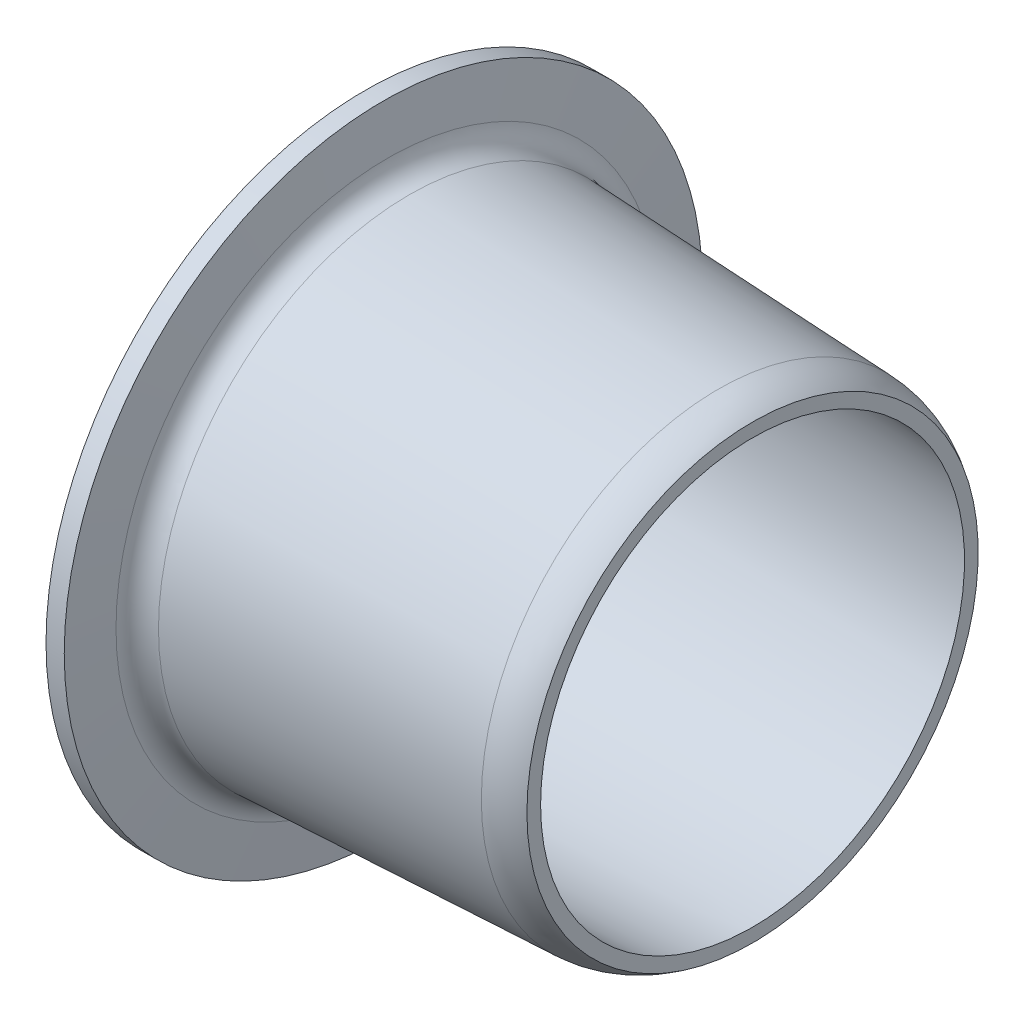
ISO-10303-21;
HEADER;
FILE_DESCRIPTION(('STEP AP214'),'2;1');
FILE_NAME('part.step','',(''),(''),'','','');
FILE_SCHEMA(('AUTOMOTIVE_DESIGN { 1 0 10303 214 1 1 1 1 }'));
ENDSEC;
DATA;
#1=APPLICATION_CONTEXT('core data for automotive mechanical design processes');
#2=APPLICATION_PROTOCOL_DEFINITION('international standard','automotive_design',2000,#1);
#3=PRODUCT_CONTEXT('',#1,'mechanical');
#4=PRODUCT('Part','Part','',(#3));
#5=PRODUCT_RELATED_PRODUCT_CATEGORY('part','',(#4));
#6=PRODUCT_DEFINITION_FORMATION('','',#4);
#7=PRODUCT_DEFINITION_CONTEXT('part definition',#1,'design');
#8=PRODUCT_DEFINITION('design','',#6,#7);
#9=PRODUCT_DEFINITION_SHAPE('','',#8);
#10=(LENGTH_UNIT() NAMED_UNIT(*) SI_UNIT(.MILLI.,.METRE.));
#11=(NAMED_UNIT(*) PLANE_ANGLE_UNIT() SI_UNIT($,.RADIAN.));
#12=(NAMED_UNIT(*) SI_UNIT($,.STERADIAN.) SOLID_ANGLE_UNIT());
#13=UNCERTAINTY_MEASURE_WITH_UNIT(LENGTH_MEASURE(1.E-05),#10,'distance_accuracy_value','');
#14=(GEOMETRIC_REPRESENTATION_CONTEXT(3) GLOBAL_UNCERTAINTY_ASSIGNED_CONTEXT((#13)) GLOBAL_UNIT_ASSIGNED_CONTEXT((#10,
#11,#12)) REPRESENTATION_CONTEXT('',''));
#15=CARTESIAN_POINT('',(0.,0.,0.));
#16=DIRECTION('',(0.,0.,1.));
#17=DIRECTION('',(1.,0.,0.));
#18=AXIS2_PLACEMENT_3D('',#15,#16,#17);
#19=CARTESIAN_POINT('',(0.196537583948713,0.,0.));
#20=DIRECTION('',(-1.,0.,0.));
#21=DIRECTION('',(0.,0.,1.));
#22=AXIS2_PLACEMENT_3D('',#19,#20,#21);
#23=CONICAL_SURFACE('',#22,2.38237350444965,1.48352986419519);
#24=CARTESIAN_POINT('',(0.16,0.,0.));
#25=DIRECTION('',(-1.,0.,0.));
#26=DIRECTION('',(0.,0.,1.));
#27=AXIS2_PLACEMENT_3D('',#24,#25,#26);
#28=CIRCLE('',#27,2.8);
#29=CARTESIAN_POINT('',(0.16,0.,2.8));
#30=VERTEX_POINT('',#29);
#31=EDGE_CURVE('E10',#30,#30,#28,.T.);
#32=ORIENTED_EDGE('',*,*,#31,.F.);
#33=EDGE_LOOP('',(#32));
#34=FACE_BOUND('',#33,.T.);
#35=CARTESIAN_POINT('',(0.196537583948713,0.,0.));
#36=DIRECTION('',(-1.,0.,0.));
#37=DIRECTION('',(0.,0.,1.));
#38=AXIS2_PLACEMENT_3D('',#35,#36,#37);
#39=CIRCLE('',#38,2.38237350444965);
#40=CARTESIAN_POINT('',(0.196537583948713,0.,2.38237350444965));
#41=VERTEX_POINT('',#40);
#42=EDGE_CURVE('E65',#41,#41,#39,.T.);
#43=ORIENTED_EDGE('',*,*,#42,.T.);
#44=EDGE_LOOP('',(#43));
#45=FACE_BOUND('',#44,.T.);
#46=ADVANCED_FACE('F34',(#34,#45),#23,.T.);
#47=CARTESIAN_POINT('',(0.,0.,0.));
#48=DIRECTION('',(-1.,0.,0.));
#49=DIRECTION('',(0.,0.,1.));
#50=AXIS2_PLACEMENT_3D('',#47,#48,#49);
#51=CYLINDRICAL_SURFACE('',#50,2.8);
#52=CARTESIAN_POINT('',(0.,0.,0.));
#53=DIRECTION('',(-1.,0.,0.));
#54=DIRECTION('',(0.,0.,1.));
#55=AXIS2_PLACEMENT_3D('',#52,#53,#54);
#56=CIRCLE('',#55,2.8);
#57=CARTESIAN_POINT('',(0.,0.,2.8));
#58=VERTEX_POINT('',#57);
#59=EDGE_CURVE('E40',#58,#58,#56,.T.);
#60=ORIENTED_EDGE('',*,*,#59,.F.);
#61=EDGE_LOOP('',(#60));
#62=FACE_BOUND('',#61,.T.);
#63=ORIENTED_EDGE('',*,*,#31,.T.);
#64=EDGE_LOOP('',(#63));
#65=FACE_BOUND('',#64,.T.);
#66=ADVANCED_FACE('F108',(#62,#65),#51,.T.);
#67=CARTESIAN_POINT('',(0.,2.19980990378841,0.));
#68=DIRECTION('',(1.,0.,0.));
#69=DIRECTION('',(0.,0.,-1.));
#70=AXIS2_PLACEMENT_3D('',#67,#68,#69);
#71=PLANE('',#70);
#72=CARTESIAN_POINT('',(0.,0.,0.));
#73=DIRECTION('',(-1.,0.,0.));
#74=DIRECTION('',(0.,0.,1.));
#75=AXIS2_PLACEMENT_3D('',#72,#73,#74);
#76=CIRCLE('',#75,2.19980990378841);
#77=CARTESIAN_POINT('',(0.,0.,2.19980990378841));
#78=VERTEX_POINT('',#77);
#79=EDGE_CURVE('E44',#78,#78,#76,.T.);
#80=ORIENTED_EDGE('',*,*,#79,.F.);
#81=EDGE_LOOP('',(#80));
#82=FACE_BOUND('',#81,.T.);
#83=ORIENTED_EDGE('',*,*,#59,.T.);
#84=EDGE_LOOP('',(#83));
#85=FACE_BOUND('',#84,.T.);
#86=ADVANCED_FACE('F103',(#82,#85),#71,.F.);
#87=CARTESIAN_POINT('',(0.2,0.,0.));
#88=DIRECTION('',(-1.,0.,0.));
#89=DIRECTION('',(0.,0.,1.));
#90=AXIS2_PLACEMENT_3D('',#87,#88,#89);
#91=TOROIDAL_SURFACE('',#90,2.19980990378841,0.2);
#92=CARTESIAN_POINT('',(0.191282067443029,0.,0.));
#93=DIRECTION('',(-1.,0.,0.));
#94=DIRECTION('',(0.,0.,1.));
#95=AXIS2_PLACEMENT_3D('',#92,#93,#94);
#96=CIRCLE('',#95,2.);
#97=CARTESIAN_POINT('',(0.191282067443029,0.,2.));
#98=VERTEX_POINT('',#97);
#99=EDGE_CURVE('E48',#98,#98,#96,.T.);
#100=ORIENTED_EDGE('',*,*,#99,.F.);
#101=EDGE_LOOP('',(#100));
#102=FACE_BOUND('',#101,.T.);
#103=ORIENTED_EDGE('',*,*,#79,.T.);
#104=EDGE_LOOP('',(#103));
#105=FACE_BOUND('',#104,.T.);
#106=ADVANCED_FACE('F97',(#102,#105),#91,.T.);
#107=CARTESIAN_POINT('',(0.191282067443029,0.,0.));
#108=DIRECTION('',(-1.,0.,0.));
#109=DIRECTION('',(0.,0.,1.));
#110=AXIS2_PLACEMENT_3D('',#107,#108,#109);
#111=CONICAL_SURFACE('',#110,2.,0.0436034784205338);
#112=CARTESIAN_POINT('',(3.4,0.,0.));
#113=DIRECTION('',(-1.,0.,0.));
#114=DIRECTION('',(0.,0.,1.));
#115=AXIS2_PLACEMENT_3D('',#112,#113,#114);
#116=CIRCLE('',#115,1.86);
#117=CARTESIAN_POINT('',(3.4,0.,1.86));
#118=VERTEX_POINT('',#117);
#119=EDGE_CURVE('E53',#118,#118,#116,.T.);
#120=ORIENTED_EDGE('',*,*,#119,.F.);
#121=EDGE_LOOP('',(#120));
#122=FACE_BOUND('',#121,.T.);
#123=ORIENTED_EDGE('',*,*,#99,.T.);
#124=EDGE_LOOP('',(#123));
#125=FACE_BOUND('',#124,.T.);
#126=ADVANCED_FACE('F91',(#122,#125),#111,.F.);
#127=CARTESIAN_POINT('',(3.4,1.98,0.));
#128=DIRECTION('',(-1.,0.,0.));
#129=DIRECTION('',(0.,0.,1.));
#130=AXIS2_PLACEMENT_3D('',#127,#128,#129);
#131=PLANE('',#130);
#132=CARTESIAN_POINT('',(3.4,0.,0.));
#133=DIRECTION('',(-1.,0.,0.));
#134=DIRECTION('',(0.,0.,1.));
#135=AXIS2_PLACEMENT_3D('',#132,#133,#134);
#136=CIRCLE('',#135,1.98);
#137=CARTESIAN_POINT('',(3.4,0.,1.98));
#138=VERTEX_POINT('',#137);
#139=EDGE_CURVE('E56',#138,#138,#136,.T.);
#140=ORIENTED_EDGE('',*,*,#139,.F.);
#141=EDGE_LOOP('',(#140));
#142=FACE_BOUND('',#141,.T.);
#143=ORIENTED_EDGE('',*,*,#119,.T.);
#144=EDGE_LOOP('',(#143));
#145=FACE_BOUND('',#144,.T.);
#146=ADVANCED_FACE('F85',(#142,#145),#131,.F.);
#147=CARTESIAN_POINT('',(3.07450129779613,0.,0.));
#148=DIRECTION('',(-1.,0.,0.));
#149=DIRECTION('',(0.,0.,1.));
#150=AXIS2_PLACEMENT_3D('',#147,#148,#149);
#151=TOROIDAL_SURFACE('',#150,1.5035038933884,0.577059741060153);
#152=CARTESIAN_POINT('',(3.1,0.,0.));
#153=DIRECTION('',(-1.,0.,0.));
#154=DIRECTION('',(0.,0.,1.));
#155=AXIS2_PLACEMENT_3D('',#152,#153,#154);
#156=CIRCLE('',#155,2.08);
#157=CARTESIAN_POINT('',(3.1,0.,2.08));
#158=VERTEX_POINT('',#157);
#159=EDGE_CURVE('E59',#158,#158,#156,.T.);
#160=ORIENTED_EDGE('',*,*,#159,.F.);
#161=EDGE_LOOP('',(#160));
#162=FACE_BOUND('',#161,.T.);
#163=ORIENTED_EDGE('',*,*,#139,.T.);
#164=EDGE_LOOP('',(#163));
#165=FACE_BOUND('',#164,.T.);
#166=ADVANCED_FACE('F79',(#162,#165),#151,.T.);
#167=CARTESIAN_POINT('',(3.1,0.,0.));
#168=DIRECTION('',(-1.,0.,0.));
#169=DIRECTION('',(0.,0.,1.));
#170=AXIS2_PLACEMENT_3D('',#167,#168,#169);
#171=CONICAL_SURFACE('',#170,2.08,0.0442016752491486);
#172=CARTESIAN_POINT('',(0.386939066926258,0.,0.));
#173=DIRECTION('',(-1.,0.,0.));
#174=DIRECTION('',(0.,0.,1.));
#175=AXIS2_PLACEMENT_3D('',#172,#173,#174);
#176=CIRCLE('',#175,2.2);
#177=CARTESIAN_POINT('',(0.386939066926258,0.,2.2));
#178=VERTEX_POINT('',#177);
#179=EDGE_CURVE('E62',#178,#178,#176,.T.);
#180=ORIENTED_EDGE('',*,*,#179,.F.);
#181=EDGE_LOOP('',(#180));
#182=FACE_BOUND('',#181,.T.);
#183=ORIENTED_EDGE('',*,*,#159,.T.);
#184=EDGE_LOOP('',(#183));
#185=FACE_BOUND('',#184,.T.);
#186=ADVANCED_FACE('F73',(#182,#185),#171,.T.);
#187=CARTESIAN_POINT('',(0.395776523567062,0.,0.));
#188=DIRECTION('',(-1.,0.,0.));
#189=DIRECTION('',(0.,0.,1.));
#190=AXIS2_PLACEMENT_3D('',#187,#188,#189);
#191=TOROIDAL_SURFACE('',#190,2.39980465299918,0.2);
#192=ORIENTED_EDGE('',*,*,#42,.F.);
#193=EDGE_LOOP('',(#192));
#194=FACE_BOUND('',#193,.T.);
#195=ORIENTED_EDGE('',*,*,#179,.T.);
#196=EDGE_LOOP('',(#195));
#197=FACE_BOUND('',#196,.T.);
#198=ADVANCED_FACE('F70',(#194,#197),#191,.F.);
#199=CLOSED_SHELL('',(#46,#66,#86,#106,#126,#146,#166,#186,#198));
#200=MANIFOLD_SOLID_BREP('B2',#199);
#201=ADVANCED_BREP_SHAPE_REPRESENTATION('',(#18,#200),#14);
#202=SHAPE_DEFINITION_REPRESENTATION(#9,#201);
ENDSEC;
END-ISO-10303-21;
